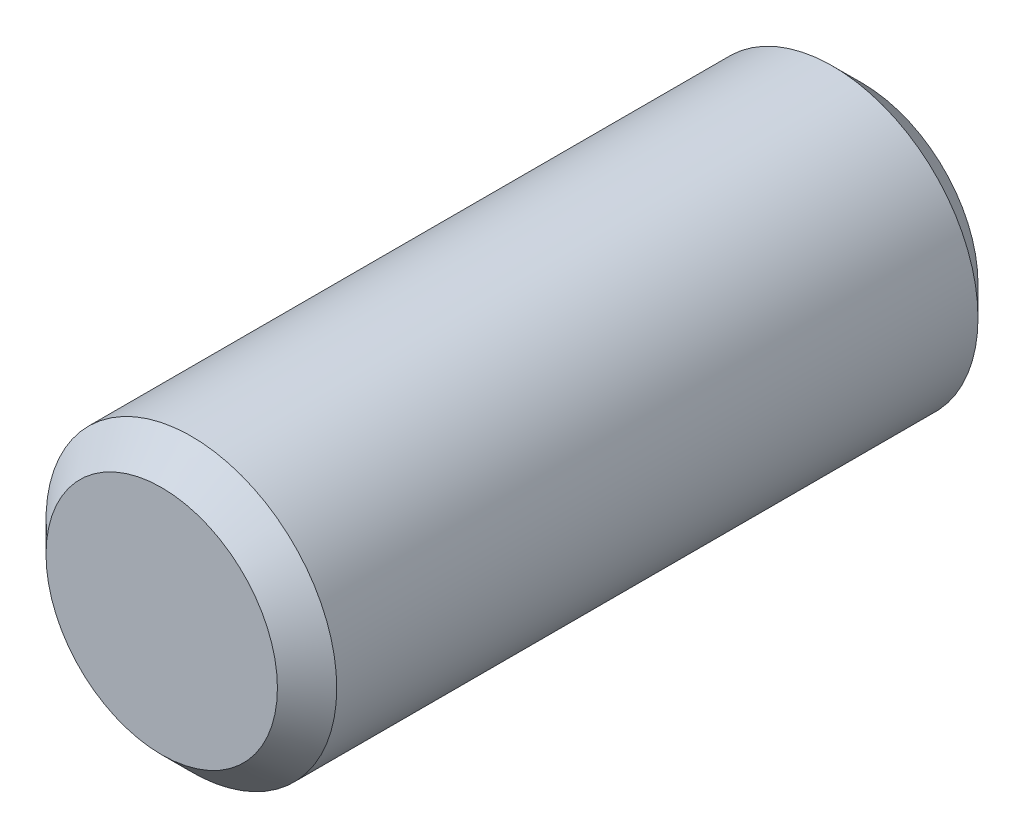
ISO-10303-21;
HEADER;
FILE_DESCRIPTION(('STEP AP214'),'2;1');
FILE_NAME('part.step','',(''),(''),'','','');
FILE_SCHEMA(('AUTOMOTIVE_DESIGN { 1 0 10303 214 1 1 1 1 }'));
ENDSEC;
DATA;
#1=APPLICATION_CONTEXT('core data for automotive mechanical design processes');
#2=APPLICATION_PROTOCOL_DEFINITION('international standard','automotive_design',2000,#1);
#3=PRODUCT_CONTEXT('',#1,'mechanical');
#4=PRODUCT('Part','Part','',(#3));
#5=PRODUCT_RELATED_PRODUCT_CATEGORY('part','',(#4));
#6=PRODUCT_DEFINITION_FORMATION('','',#4);
#7=PRODUCT_DEFINITION_CONTEXT('part definition',#1,'design');
#8=PRODUCT_DEFINITION('design','',#6,#7);
#9=PRODUCT_DEFINITION_SHAPE('','',#8);
#10=(LENGTH_UNIT() NAMED_UNIT(*) SI_UNIT(.MILLI.,.METRE.));
#11=(NAMED_UNIT(*) PLANE_ANGLE_UNIT() SI_UNIT($,.RADIAN.));
#12=(NAMED_UNIT(*) SI_UNIT($,.STERADIAN.) SOLID_ANGLE_UNIT());
#13=UNCERTAINTY_MEASURE_WITH_UNIT(LENGTH_MEASURE(1.E-05),#10,'distance_accuracy_value','');
#14=(GEOMETRIC_REPRESENTATION_CONTEXT(3) GLOBAL_UNCERTAINTY_ASSIGNED_CONTEXT((#13)) GLOBAL_UNIT_ASSIGNED_CONTEXT((#10,
#11,#12)) REPRESENTATION_CONTEXT('',''));
#15=CARTESIAN_POINT('',(0.,0.,0.));
#16=DIRECTION('',(0.,0.,1.));
#17=DIRECTION('',(1.,0.,0.));
#18=AXIS2_PLACEMENT_3D('',#15,#16,#17);
#19=CARTESIAN_POINT('',(0.,0.,12.));
#20=DIRECTION('',(0.,0.,-1.));
#21=DIRECTION('',(-1.,0.,0.));
#22=AXIS2_PLACEMENT_3D('',#19,#20,#21);
#23=CYLINDRICAL_SURFACE('',#22,2.49);
#24=CARTESIAN_POINT('',(0.,0.,0.508));
#25=DIRECTION('',(0.,0.,1.));
#26=DIRECTION('',(1.,0.,0.));
#27=AXIS2_PLACEMENT_3D('',#24,#25,#26);
#28=CIRCLE('',#27,2.49);
#29=CARTESIAN_POINT('',(2.49,0.,0.508));
#30=VERTEX_POINT('',#29);
#31=EDGE_CURVE('E41',#30,#30,#28,.T.);
#32=ORIENTED_EDGE('',*,*,#31,.T.);
#33=EDGE_LOOP('',(#32));
#34=FACE_BOUND('',#33,.T.);
#35=CARTESIAN_POINT('',(0.,0.,11.492));
#36=DIRECTION('',(0.,0.,1.));
#37=DIRECTION('',(1.,0.,0.));
#38=AXIS2_PLACEMENT_3D('',#35,#36,#37);
#39=CIRCLE('',#38,2.49);
#40=CARTESIAN_POINT('',(2.49,0.,11.492));
#41=VERTEX_POINT('',#40);
#42=EDGE_CURVE('E45',#41,#41,#39,.F.);
#43=ORIENTED_EDGE('',*,*,#42,.T.);
#44=EDGE_LOOP('',(#43));
#45=FACE_BOUND('',#44,.T.);
#46=ADVANCED_FACE('F30',(#34,#45),#23,.T.);
#47=CARTESIAN_POINT('',(0.,0.,12.));
#48=DIRECTION('',(0.,0.,1.));
#49=DIRECTION('',(1.,0.,0.));
#50=AXIS2_PLACEMENT_3D('',#47,#48,#49);
#51=PLANE('',#50);
#52=CARTESIAN_POINT('',(0.,0.,12.));
#53=DIRECTION('',(0.,0.,1.));
#54=DIRECTION('',(1.,0.,0.));
#55=AXIS2_PLACEMENT_3D('',#52,#53,#54);
#56=CIRCLE('',#55,1.982);
#57=CARTESIAN_POINT('',(1.982,0.,12.));
#58=VERTEX_POINT('',#57);
#59=EDGE_CURVE('E10',#58,#58,#56,.T.);
#60=ORIENTED_EDGE('',*,*,#59,.T.);
#61=EDGE_LOOP('',(#60));
#62=FACE_BOUND('',#61,.T.);
#63=ADVANCED_FACE('F61',(#62),#51,.T.);
#64=CARTESIAN_POINT('',(0.,0.,0.));
#65=DIRECTION('',(0.,0.,1.));
#66=DIRECTION('',(1.,0.,0.));
#67=AXIS2_PLACEMENT_3D('',#64,#65,#66);
#68=PLANE('',#67);
#69=CARTESIAN_POINT('',(0.,0.,0.));
#70=DIRECTION('',(0.,0.,1.));
#71=DIRECTION('',(1.,0.,0.));
#72=AXIS2_PLACEMENT_3D('',#69,#70,#71);
#73=CIRCLE('',#72,1.982);
#74=CARTESIAN_POINT('',(1.982,0.,0.));
#75=VERTEX_POINT('',#74);
#76=EDGE_CURVE('E37',#75,#75,#73,.F.);
#77=ORIENTED_EDGE('',*,*,#76,.T.);
#78=EDGE_LOOP('',(#77));
#79=FACE_BOUND('',#78,.T.);
#80=ADVANCED_FACE('F58',(#79),#68,.F.);
#81=CARTESIAN_POINT('',(0.,0.,0.508));
#82=DIRECTION('',(0.,0.,1.));
#83=DIRECTION('',(1.,0.,0.));
#84=AXIS2_PLACEMENT_3D('',#81,#82,#83);
#85=CONICAL_SURFACE('',#84,2.49,0.785398163397449);
#86=ORIENTED_EDGE('',*,*,#76,.F.);
#87=EDGE_LOOP('',(#86));
#88=FACE_BOUND('',#87,.T.);
#89=ORIENTED_EDGE('',*,*,#31,.F.);
#90=EDGE_LOOP('',(#89));
#91=FACE_BOUND('',#90,.T.);
#92=ADVANCED_FACE('F54',(#88,#91),#85,.T.);
#93=CARTESIAN_POINT('',(0.,0.,12.));
#94=DIRECTION('',(0.,0.,-1.));
#95=DIRECTION('',(-1.,0.,0.));
#96=AXIS2_PLACEMENT_3D('',#93,#94,#95);
#97=CONICAL_SURFACE('',#96,1.982,0.785398163397446);
#98=ORIENTED_EDGE('',*,*,#42,.F.);
#99=EDGE_LOOP('',(#98));
#100=FACE_BOUND('',#99,.T.);
#101=ORIENTED_EDGE('',*,*,#59,.F.);
#102=EDGE_LOOP('',(#101));
#103=FACE_BOUND('',#102,.T.);
#104=ADVANCED_FACE('F32',(#100,#103),#97,.T.);
#105=CLOSED_SHELL('',(#46,#63,#80,#92,#104));
#106=MANIFOLD_SOLID_BREP('B2',#105);
#107=ADVANCED_BREP_SHAPE_REPRESENTATION('',(#18,#106),#14);
#108=SHAPE_DEFINITION_REPRESENTATION(#9,#107);
ENDSEC;
END-ISO-10303-21;
